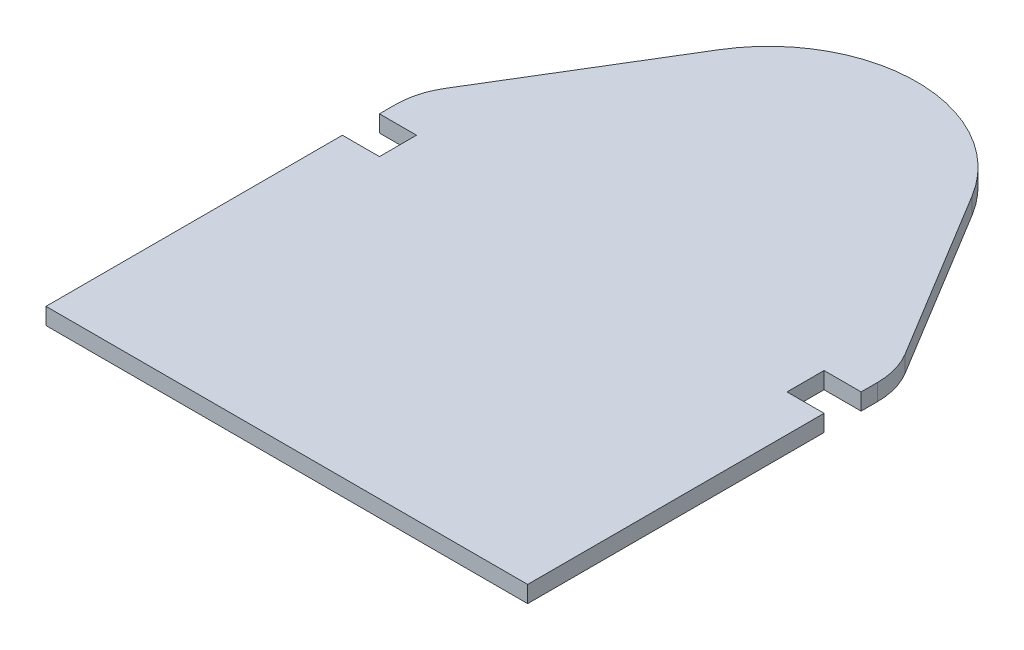
ISO-10303-21;
HEADER;
FILE_DESCRIPTION(('STEP AP214'),'2;1');
FILE_NAME('part.step','',(''),(''),'','','');
FILE_SCHEMA(('AUTOMOTIVE_DESIGN { 1 0 10303 214 1 1 1 1 }'));
ENDSEC;
DATA;
#1=APPLICATION_CONTEXT('core data for automotive mechanical design processes');
#2=APPLICATION_PROTOCOL_DEFINITION('international standard','automotive_design',2000,#1);
#3=PRODUCT_CONTEXT('',#1,'mechanical');
#4=PRODUCT('Part','Part','',(#3));
#5=PRODUCT_RELATED_PRODUCT_CATEGORY('part','',(#4));
#6=PRODUCT_DEFINITION_FORMATION('','',#4);
#7=PRODUCT_DEFINITION_CONTEXT('part definition',#1,'design');
#8=PRODUCT_DEFINITION('design','',#6,#7);
#9=PRODUCT_DEFINITION_SHAPE('','',#8);
#10=(LENGTH_UNIT() NAMED_UNIT(*) SI_UNIT(.MILLI.,.METRE.));
#11=(NAMED_UNIT(*) PLANE_ANGLE_UNIT() SI_UNIT($,.RADIAN.));
#12=(NAMED_UNIT(*) SI_UNIT($,.STERADIAN.) SOLID_ANGLE_UNIT());
#13=UNCERTAINTY_MEASURE_WITH_UNIT(LENGTH_MEASURE(1.E-05),#10,'distance_accuracy_value','');
#14=(GEOMETRIC_REPRESENTATION_CONTEXT(3) GLOBAL_UNCERTAINTY_ASSIGNED_CONTEXT((#13)) GLOBAL_UNIT_ASSIGNED_CONTEXT((#10,
#11,#12)) REPRESENTATION_CONTEXT('',''));
#15=CARTESIAN_POINT('',(0.,0.,0.));
#16=DIRECTION('',(0.,0.,1.));
#17=DIRECTION('',(1.,0.,0.));
#18=AXIS2_PLACEMENT_3D('',#15,#16,#17);
#19=CARTESIAN_POINT('',(65.,4.5,-25.));
#20=DIRECTION('',(-1.,0.,0.));
#21=DIRECTION('',(0.,0.,1.));
#22=AXIS2_PLACEMENT_3D('',#19,#20,#21);
#23=PLANE('',#22);
#24=DIRECTION('',(0.,0.,-1.));
#25=VECTOR('',#24,1.);
#26=CARTESIAN_POINT('',(65.,0.,-25.));
#27=LINE('',#26,#25);
#28=CARTESIAN_POINT('',(65.,0.,75.));
#29=VERTEX_POINT('',#28);
#30=CARTESIAN_POINT('',(65.,0.,-5.00000000000002));
#31=VERTEX_POINT('',#30);
#32=EDGE_CURVE('E328',#29,#31,#27,.T.);
#33=ORIENTED_EDGE('',*,*,#32,.T.);
#34=DIRECTION('',(0.,1.,0.));
#35=VECTOR('',#34,1.);
#36=CARTESIAN_POINT('',(65.,0.,-5.00000000000002));
#37=LINE('',#36,#35);
#38=CARTESIAN_POINT('',(65.,4.5,-5.00000000000002));
#39=VERTEX_POINT('',#38);
#40=EDGE_CURVE('E287',#31,#39,#37,.T.);
#41=ORIENTED_EDGE('',*,*,#40,.T.);
#42=DIRECTION('',(0.,0.,-1.));
#43=VECTOR('',#42,1.);
#44=CARTESIAN_POINT('',(65.,4.5,-25.));
#45=LINE('',#44,#43);
#46=CARTESIAN_POINT('',(65.,4.5,75.));
#47=VERTEX_POINT('',#46);
#48=EDGE_CURVE('E310',#47,#39,#45,.T.);
#49=ORIENTED_EDGE('',*,*,#48,.F.);
#50=DIRECTION('',(0.,-1.,0.));
#51=VECTOR('',#50,1.);
#52=CARTESIAN_POINT('',(65.,4.5,75.));
#53=LINE('',#52,#51);
#54=EDGE_CURVE('E201',#47,#29,#53,.T.);
#55=ORIENTED_EDGE('',*,*,#54,.T.);
#56=EDGE_LOOP('',(#33,#41,#49,#55));
#57=FACE_BOUND('',#56,.T.);
#58=ADVANCED_FACE('F48',(#57),#23,.F.);
#59=CARTESIAN_POINT('',(-65.,4.5,-25.));
#60=DIRECTION('',(1.,0.,0.));
#61=DIRECTION('',(0.,0.,-1.));
#62=AXIS2_PLACEMENT_3D('',#59,#60,#61);
#63=PLANE('',#62);
#64=DIRECTION('',(0.,0.,1.));
#65=VECTOR('',#64,1.);
#66=CARTESIAN_POINT('',(-65.,0.,-25.));
#67=LINE('',#66,#65);
#68=CARTESIAN_POINT('',(-65.,0.,-19.4053884885353));
#69=VERTEX_POINT('',#68);
#70=CARTESIAN_POINT('',(-65.,0.,-15.));
#71=VERTEX_POINT('',#70);
#72=EDGE_CURVE('E187',#69,#71,#67,.T.);
#73=ORIENTED_EDGE('',*,*,#72,.T.);
#74=DIRECTION('',(0.,1.,0.));
#75=VECTOR('',#74,1.);
#76=CARTESIAN_POINT('',(-65.,0.,-15.));
#77=LINE('',#76,#75);
#78=CARTESIAN_POINT('',(-65.,4.5,-15.));
#79=VERTEX_POINT('',#78);
#80=EDGE_CURVE('E268',#71,#79,#77,.T.);
#81=ORIENTED_EDGE('',*,*,#80,.T.);
#82=DIRECTION('',(0.,0.,1.));
#83=VECTOR('',#82,1.);
#84=CARTESIAN_POINT('',(-65.,4.5,-25.));
#85=LINE('',#84,#83);
#86=CARTESIAN_POINT('',(-65.,4.5,-19.4053884885353));
#87=VERTEX_POINT('',#86);
#88=EDGE_CURVE('E246',#87,#79,#85,.T.);
#89=ORIENTED_EDGE('',*,*,#88,.F.);
#90=DIRECTION('',(0.,-1.,0.));
#91=VECTOR('',#90,1.);
#92=CARTESIAN_POINT('',(-65.,4.5,-19.4053884885353));
#93=LINE('',#92,#91);
#94=EDGE_CURVE('E57',#87,#69,#93,.T.);
#95=ORIENTED_EDGE('',*,*,#94,.T.);
#96=EDGE_LOOP('',(#73,#81,#89,#95));
#97=FACE_BOUND('',#96,.T.);
#98=ADVANCED_FACE('F243',(#97),#63,.F.);
#99=CARTESIAN_POINT('',(65.,4.5,-15.));
#100=VERTEX_POINT('',#99);
#101=CARTESIAN_POINT('',(65.,4.5,-19.4053884885353));
#102=VERTEX_POINT('',#101);
#103=EDGE_CURVE('E200',#100,#102,#45,.T.);
#104=ORIENTED_EDGE('',*,*,#103,.F.);
#105=DIRECTION('',(0.,1.,0.));
#106=VECTOR('',#105,1.);
#107=CARTESIAN_POINT('',(65.,0.,-15.));
#108=LINE('',#107,#106);
#109=CARTESIAN_POINT('',(65.,0.,-15.));
#110=VERTEX_POINT('',#109);
#111=EDGE_CURVE('E277',#110,#100,#108,.T.);
#112=ORIENTED_EDGE('',*,*,#111,.F.);
#113=CARTESIAN_POINT('',(65.,0.,-19.4053884885353));
#114=VERTEX_POINT('',#113);
#115=EDGE_CURVE('E271',#110,#114,#27,.T.);
#116=ORIENTED_EDGE('',*,*,#115,.T.);
#117=DIRECTION('',(0.,-1.,0.));
#118=VECTOR('',#117,1.);
#119=CARTESIAN_POINT('',(65.,4.5,-19.4053884885353));
#120=LINE('',#119,#118);
#121=EDGE_CURVE('E228',#114,#102,#120,.F.);
#122=ORIENTED_EDGE('',*,*,#121,.T.);
#123=EDGE_LOOP('',(#104,#112,#116,#122));
#124=FACE_BOUND('',#123,.T.);
#125=ADVANCED_FACE('F363',(#124),#23,.F.);
#126=CARTESIAN_POINT('',(65.,4.5,-25.));
#127=DIRECTION('',(-0.854858792791353,0.,0.5188607177146));
#128=DIRECTION('',(0.5188607177146,0.,0.854858792791353));
#129=AXIS2_PLACEMENT_3D('',#126,#127,#128);
#130=PLANE('',#129);
#131=DIRECTION('',(-0.5188607177146,0.,-0.854858792791353));
#132=VECTOR('',#131,1.);
#133=CARTESIAN_POINT('',(65.,4.5,-25.));
#134=LINE('',#133,#132);
#135=CARTESIAN_POINT('',(62.0971758558271,4.5,-29.7826028428273));
#136=VERTEX_POINT('',#135);
#137=CARTESIAN_POINT('',(34.1943517116541,4.5,-75.754428708584));
#138=VERTEX_POINT('',#137);
#139=EDGE_CURVE('E314',#136,#138,#134,.T.);
#140=ORIENTED_EDGE('',*,*,#139,.F.);
#141=DIRECTION('',(0.,-1.,0.));
#142=VECTOR('',#141,1.);
#143=CARTESIAN_POINT('',(62.0971758558271,4.5,-29.7826028428273));
#144=LINE('',#143,#142);
#145=CARTESIAN_POINT('',(62.0971758558271,0.,-29.7826028428273));
#146=VERTEX_POINT('',#145);
#147=EDGE_CURVE('E217',#136,#146,#144,.T.);
#148=ORIENTED_EDGE('',*,*,#147,.T.);
#149=DIRECTION('',(-0.5188607177146,0.,-0.854858792791353));
#150=VECTOR('',#149,1.);
#151=CARTESIAN_POINT('',(65.,0.,-25.));
#152=LINE('',#151,#150);
#153=CARTESIAN_POINT('',(34.1943517116541,0.,-75.754428708584));
#154=VERTEX_POINT('',#153);
#155=EDGE_CURVE('E332',#146,#154,#152,.T.);
#156=ORIENTED_EDGE('',*,*,#155,.T.);
#157=DIRECTION('',(0.,-1.,0.));
#158=VECTOR('',#157,1.);
#159=CARTESIAN_POINT('',(34.1943517116541,4.5,-75.754428708584));
#160=LINE('',#159,#158);
#161=EDGE_CURVE('E213',#138,#154,#160,.T.);
#162=ORIENTED_EDGE('',*,*,#161,.F.);
#163=EDGE_LOOP('',(#140,#148,#156,#162));
#164=FACE_BOUND('',#163,.T.);
#165=ADVANCED_FACE('F370',(#164),#130,.F.);
#166=CARTESIAN_POINT('',(0.,4.5,-55.));
#167=DIRECTION('',(0.,-1.,0.));
#168=DIRECTION('',(0.,0.,-1.));
#169=AXIS2_PLACEMENT_3D('',#166,#167,#168);
#170=CYLINDRICAL_SURFACE('',#169,40.);
#171=CARTESIAN_POINT('',(0.,0.,-55.));
#172=DIRECTION('',(0.,1.,0.));
#173=DIRECTION('',(0.,0.,1.));
#174=AXIS2_PLACEMENT_3D('',#171,#172,#173);
#175=CIRCLE('',#174,40.);
#176=CARTESIAN_POINT('',(-34.1943517116542,0.,-75.754428708584));
#177=VERTEX_POINT('',#176);
#178=EDGE_CURVE('E194',#154,#177,#175,.T.);
#179=ORIENTED_EDGE('',*,*,#178,.T.);
#180=DIRECTION('',(0.,-1.,0.));
#181=VECTOR('',#180,1.);
#182=CARTESIAN_POINT('',(-34.1943517116542,4.5,-75.754428708584));
#183=LINE('',#182,#181);
#184=CARTESIAN_POINT('',(-34.1943517116542,4.5,-75.754428708584));
#185=VERTEX_POINT('',#184);
#186=EDGE_CURVE('E209',#185,#177,#183,.T.);
#187=ORIENTED_EDGE('',*,*,#186,.F.);
#188=CARTESIAN_POINT('',(0.,4.5,-55.));
#189=DIRECTION('',(0.,1.,0.));
#190=DIRECTION('',(0.,0.,1.));
#191=AXIS2_PLACEMENT_3D('',#188,#189,#190);
#192=CIRCLE('',#191,40.);
#193=EDGE_CURVE('E317',#138,#185,#192,.T.);
#194=ORIENTED_EDGE('',*,*,#193,.F.);
#195=ORIENTED_EDGE('',*,*,#161,.T.);
#196=EDGE_LOOP('',(#179,#187,#194,#195));
#197=FACE_BOUND('',#196,.T.);
#198=ADVANCED_FACE('F338',(#197),#170,.T.);
#199=CARTESIAN_POINT('',(-65.,4.5,-25.));
#200=DIRECTION('',(0.854858792791354,0.,0.5188607177146));
#201=DIRECTION('',(0.5188607177146,0.,-0.854858792791354));
#202=AXIS2_PLACEMENT_3D('',#199,#200,#201);
#203=PLANE('',#202);
#204=DIRECTION('',(-0.5188607177146,0.,0.854858792791354));
#205=VECTOR('',#204,1.);
#206=CARTESIAN_POINT('',(-65.,0.,-25.));
#207=LINE('',#206,#205);
#208=CARTESIAN_POINT('',(-62.0971758558271,0.,-29.7826028428273));
#209=VERTEX_POINT('',#208);
#210=EDGE_CURVE('E188',#177,#209,#207,.T.);
#211=ORIENTED_EDGE('',*,*,#210,.T.);
#212=DIRECTION('',(0.,-1.,0.));
#213=VECTOR('',#212,1.);
#214=CARTESIAN_POINT('',(-62.0971758558271,4.5,-29.7826028428273));
#215=LINE('',#214,#213);
#216=CARTESIAN_POINT('',(-62.0971758558271,4.5,-29.7826028428273));
#217=VERTEX_POINT('',#216);
#218=EDGE_CURVE('E11',#209,#217,#215,.F.);
#219=ORIENTED_EDGE('',*,*,#218,.T.);
#220=DIRECTION('',(-0.5188607177146,0.,0.854858792791354));
#221=VECTOR('',#220,1.);
#222=CARTESIAN_POINT('',(-65.,4.5,-25.));
#223=LINE('',#222,#221);
#224=EDGE_CURVE('E320',#185,#217,#223,.T.);
#225=ORIENTED_EDGE('',*,*,#224,.F.);
#226=ORIENTED_EDGE('',*,*,#186,.T.);
#227=EDGE_LOOP('',(#211,#219,#225,#226));
#228=FACE_BOUND('',#227,.T.);
#229=ADVANCED_FACE('F344',(#228),#203,.F.);
#230=CARTESIAN_POINT('',(-65.,4.5,-4.99999999999999));
#231=VERTEX_POINT('',#230);
#232=CARTESIAN_POINT('',(-65.,4.5,75.));
#233=VERTEX_POINT('',#232);
#234=EDGE_CURVE('E178',#231,#233,#85,.T.);
#235=ORIENTED_EDGE('',*,*,#234,.F.);
#236=DIRECTION('',(0.,1.,0.));
#237=VECTOR('',#236,1.);
#238=CARTESIAN_POINT('',(-65.,0.,-4.99999999999999));
#239=LINE('',#238,#237);
#240=CARTESIAN_POINT('',(-65.,0.,-4.99999999999999));
#241=VERTEX_POINT('',#240);
#242=EDGE_CURVE('E164',#241,#231,#239,.T.);
#243=ORIENTED_EDGE('',*,*,#242,.F.);
#244=CARTESIAN_POINT('',(-65.,0.,75.));
#245=VERTEX_POINT('',#244);
#246=EDGE_CURVE('E176',#241,#245,#67,.T.);
#247=ORIENTED_EDGE('',*,*,#246,.T.);
#248=DIRECTION('',(0.,-1.,0.));
#249=VECTOR('',#248,1.);
#250=CARTESIAN_POINT('',(-65.,4.5,75.));
#251=LINE('',#250,#249);
#252=EDGE_CURVE('E205',#233,#245,#251,.T.);
#253=ORIENTED_EDGE('',*,*,#252,.F.);
#254=EDGE_LOOP('',(#235,#243,#247,#253));
#255=FACE_BOUND('',#254,.T.);
#256=ADVANCED_FACE('F174',(#255),#63,.F.);
#257=CARTESIAN_POINT('',(-65.,4.5,75.));
#258=DIRECTION('',(0.,0.,-1.));
#259=DIRECTION('',(-1.,0.,0.));
#260=AXIS2_PLACEMENT_3D('',#257,#258,#259);
#261=PLANE('',#260);
#262=DIRECTION('',(1.,0.,0.));
#263=VECTOR('',#262,1.);
#264=CARTESIAN_POINT('',(-65.,0.,75.));
#265=LINE('',#264,#263);
#266=EDGE_CURVE('E185',#245,#29,#265,.T.);
#267=ORIENTED_EDGE('',*,*,#266,.T.);
#268=ORIENTED_EDGE('',*,*,#54,.F.);
#269=DIRECTION('',(1.,0.,0.));
#270=VECTOR('',#269,1.);
#271=CARTESIAN_POINT('',(-65.,4.5,75.));
#272=LINE('',#271,#270);
#273=EDGE_CURVE('E206',#233,#47,#272,.T.);
#274=ORIENTED_EDGE('',*,*,#273,.F.);
#275=ORIENTED_EDGE('',*,*,#252,.T.);
#276=EDGE_LOOP('',(#267,#268,#274,#275));
#277=FACE_BOUND('',#276,.T.);
#278=ADVANCED_FACE('F389',(#277),#261,.F.);
#279=CARTESIAN_POINT('',(0.,4.5,-55.));
#280=DIRECTION('',(0.,1.,0.));
#281=DIRECTION('',(0.,0.,1.));
#282=AXIS2_PLACEMENT_3D('',#279,#280,#281);
#283=PLANE('',#282);
#284=DIRECTION('',(-1.,0.,0.));
#285=VECTOR('',#284,1.);
#286=CARTESIAN_POINT('',(-65.,4.5,-15.));
#287=LINE('',#286,#285);
#288=CARTESIAN_POINT('',(-55.,4.5,-15.));
#289=VERTEX_POINT('',#288);
#290=EDGE_CURVE('E170',#289,#79,#287,.T.);
#291=ORIENTED_EDGE('',*,*,#290,.F.);
#292=DIRECTION('',(0.,0.,-1.));
#293=VECTOR('',#292,1.);
#294=CARTESIAN_POINT('',(-55.,4.5,-15.));
#295=LINE('',#294,#293);
#296=CARTESIAN_POINT('',(-55.,4.5,-4.99999999999999));
#297=VERTEX_POINT('',#296);
#298=EDGE_CURVE('E261',#297,#289,#295,.T.);
#299=ORIENTED_EDGE('',*,*,#298,.F.);
#300=DIRECTION('',(1.,0.,0.));
#301=VECTOR('',#300,1.);
#302=CARTESIAN_POINT('',(-65.,4.5,-4.99999999999999));
#303=LINE('',#302,#301);
#304=EDGE_CURVE('E258',#231,#297,#303,.T.);
#305=ORIENTED_EDGE('',*,*,#304,.F.);
#306=ORIENTED_EDGE('',*,*,#234,.T.);
#307=ORIENTED_EDGE('',*,*,#273,.T.);
#308=ORIENTED_EDGE('',*,*,#48,.T.);
#309=DIRECTION('',(1.,0.,0.));
#310=VECTOR('',#309,1.);
#311=CARTESIAN_POINT('',(65.,4.5,-5.00000000000002));
#312=LINE('',#311,#310);
#313=CARTESIAN_POINT('',(55.,4.5,-5.00000000000002));
#314=VERTEX_POINT('',#313);
#315=EDGE_CURVE('E291',#314,#39,#312,.T.);
#316=ORIENTED_EDGE('',*,*,#315,.F.);
#317=DIRECTION('',(0.,0.,1.));
#318=VECTOR('',#317,1.);
#319=CARTESIAN_POINT('',(55.,4.5,-15.));
#320=LINE('',#319,#318);
#321=CARTESIAN_POINT('',(55.,4.5,-15.));
#322=VERTEX_POINT('',#321);
#323=EDGE_CURVE('E294',#322,#314,#320,.T.);
#324=ORIENTED_EDGE('',*,*,#323,.F.);
#325=DIRECTION('',(-1.,0.,0.));
#326=VECTOR('',#325,1.);
#327=CARTESIAN_POINT('',(65.,4.5,-15.));
#328=LINE('',#327,#326);
#329=EDGE_CURVE('E262',#100,#322,#328,.T.);
#330=ORIENTED_EDGE('',*,*,#329,.F.);
#331=ORIENTED_EDGE('',*,*,#103,.T.);
#332=CARTESIAN_POINT('',(45.,4.5,-19.4053884885353));
#333=DIRECTION('',(0.,1.,0.));
#334=DIRECTION('',(0.,0.,1.));
#335=AXIS2_PLACEMENT_3D('',#332,#333,#334);
#336=CIRCLE('',#335,20.);
#337=EDGE_CURVE('E235',#102,#136,#336,.T.);
#338=ORIENTED_EDGE('',*,*,#337,.T.);
#339=ORIENTED_EDGE('',*,*,#139,.T.);
#340=ORIENTED_EDGE('',*,*,#193,.T.);
#341=ORIENTED_EDGE('',*,*,#224,.T.);
#342=CARTESIAN_POINT('',(-45.,4.5,-19.4053884885353));
#343=DIRECTION('',(0.,1.,0.));
#344=DIRECTION('',(0.,0.,1.));
#345=AXIS2_PLACEMENT_3D('',#342,#343,#344);
#346=CIRCLE('',#345,20.);
#347=EDGE_CURVE('E232',#217,#87,#346,.T.);
#348=ORIENTED_EDGE('',*,*,#347,.T.);
#349=ORIENTED_EDGE('',*,*,#88,.T.);
#350=EDGE_LOOP('',(#291,#299,#305,#306,#307,#308,#316,#324,#330,#331,#338,#339,#340,#341,#348,#349));
#351=FACE_BOUND('',#350,.T.);
#352=ADVANCED_FACE('F348',(#351),#283,.T.);
#353=CARTESIAN_POINT('',(0.,0.,-55.));
#354=DIRECTION('',(0.,1.,0.));
#355=DIRECTION('',(0.,0.,1.));
#356=AXIS2_PLACEMENT_3D('',#353,#354,#355);
#357=PLANE('',#356);
#358=DIRECTION('',(0.,0.,-1.));
#359=VECTOR('',#358,1.);
#360=CARTESIAN_POINT('',(-55.,0.,-15.));
#361=LINE('',#360,#359);
#362=CARTESIAN_POINT('',(-55.,0.,-4.99999999999999));
#363=VERTEX_POINT('',#362);
#364=CARTESIAN_POINT('',(-55.,0.,-15.));
#365=VERTEX_POINT('',#364);
#366=EDGE_CURVE('E64',#363,#365,#361,.T.);
#367=ORIENTED_EDGE('',*,*,#366,.T.);
#368=DIRECTION('',(-1.,0.,0.));
#369=VECTOR('',#368,1.);
#370=CARTESIAN_POINT('',(-65.,0.,-15.));
#371=LINE('',#370,#369);
#372=EDGE_CURVE('E180',#365,#71,#371,.T.);
#373=ORIENTED_EDGE('',*,*,#372,.T.);
#374=ORIENTED_EDGE('',*,*,#72,.F.);
#375=CARTESIAN_POINT('',(-45.,0.,-19.4053884885353));
#376=DIRECTION('',(0.,1.,0.));
#377=DIRECTION('',(0.,0.,1.));
#378=AXIS2_PLACEMENT_3D('',#375,#376,#377);
#379=CIRCLE('',#378,20.);
#380=EDGE_CURVE('E221',#69,#209,#379,.F.);
#381=ORIENTED_EDGE('',*,*,#380,.T.);
#382=ORIENTED_EDGE('',*,*,#210,.F.);
#383=ORIENTED_EDGE('',*,*,#178,.F.);
#384=ORIENTED_EDGE('',*,*,#155,.F.);
#385=CARTESIAN_POINT('',(45.,0.,-19.4053884885353));
#386=DIRECTION('',(0.,1.,0.));
#387=DIRECTION('',(0.,0.,1.));
#388=AXIS2_PLACEMENT_3D('',#385,#386,#387);
#389=CIRCLE('',#388,20.);
#390=EDGE_CURVE('E224',#146,#114,#389,.F.);
#391=ORIENTED_EDGE('',*,*,#390,.T.);
#392=ORIENTED_EDGE('',*,*,#115,.F.);
#393=DIRECTION('',(-1.,0.,0.));
#394=VECTOR('',#393,1.);
#395=CARTESIAN_POINT('',(65.,0.,-15.));
#396=LINE('',#395,#394);
#397=CARTESIAN_POINT('',(55.,0.,-15.));
#398=VERTEX_POINT('',#397);
#399=EDGE_CURVE('E295',#110,#398,#396,.T.);
#400=ORIENTED_EDGE('',*,*,#399,.T.);
#401=DIRECTION('',(0.,0.,1.));
#402=VECTOR('',#401,1.);
#403=CARTESIAN_POINT('',(55.,0.,-15.));
#404=LINE('',#403,#402);
#405=CARTESIAN_POINT('',(55.,0.,-5.00000000000002));
#406=VERTEX_POINT('',#405);
#407=EDGE_CURVE('E72',#398,#406,#404,.T.);
#408=ORIENTED_EDGE('',*,*,#407,.T.);
#409=DIRECTION('',(1.,0.,0.));
#410=VECTOR('',#409,1.);
#411=CARTESIAN_POINT('',(65.,0.,-5.00000000000002));
#412=LINE('',#411,#410);
#413=EDGE_CURVE('E280',#406,#31,#412,.T.);
#414=ORIENTED_EDGE('',*,*,#413,.T.);
#415=ORIENTED_EDGE('',*,*,#32,.F.);
#416=ORIENTED_EDGE('',*,*,#266,.F.);
#417=ORIENTED_EDGE('',*,*,#246,.F.);
#418=DIRECTION('',(1.,0.,0.));
#419=VECTOR('',#418,1.);
#420=CARTESIAN_POINT('',(-65.,0.,-4.99999999999999));
#421=LINE('',#420,#419);
#422=EDGE_CURVE('E160',#241,#363,#421,.T.);
#423=ORIENTED_EDGE('',*,*,#422,.T.);
#424=EDGE_LOOP('',(#367,#373,#374,#381,#382,#383,#384,#391,#392,#400,#408,#414,#415,#416,#417,#423));
#425=FACE_BOUND('',#424,.T.);
#426=ADVANCED_FACE('F183',(#425),#357,.F.);
#427=CARTESIAN_POINT('',(45.,4.5,-19.4053884885353));
#428=DIRECTION('',(0.,-1.,0.));
#429=DIRECTION('',(0.,0.,-1.));
#430=AXIS2_PLACEMENT_3D('',#427,#428,#429);
#431=CYLINDRICAL_SURFACE('',#430,20.);
#432=ORIENTED_EDGE('',*,*,#337,.F.);
#433=ORIENTED_EDGE('',*,*,#121,.F.);
#434=ORIENTED_EDGE('',*,*,#390,.F.);
#435=ORIENTED_EDGE('',*,*,#147,.F.);
#436=EDGE_LOOP('',(#432,#433,#434,#435));
#437=FACE_BOUND('',#436,.T.);
#438=ADVANCED_FACE('F351',(#437),#431,.T.);
#439=CARTESIAN_POINT('',(-45.,4.5,-19.4053884885353));
#440=DIRECTION('',(0.,-1.,0.));
#441=DIRECTION('',(0.,0.,-1.));
#442=AXIS2_PLACEMENT_3D('',#439,#440,#441);
#443=CYLINDRICAL_SURFACE('',#442,20.);
#444=ORIENTED_EDGE('',*,*,#347,.F.);
#445=ORIENTED_EDGE('',*,*,#218,.F.);
#446=ORIENTED_EDGE('',*,*,#380,.F.);
#447=ORIENTED_EDGE('',*,*,#94,.F.);
#448=EDGE_LOOP('',(#444,#445,#446,#447));
#449=FACE_BOUND('',#448,.T.);
#450=ADVANCED_FACE('F50',(#449),#443,.T.);
#451=CARTESIAN_POINT('',(65.,0.,-5.00000000000002));
#452=DIRECTION('',(0.,0.,1.));
#453=DIRECTION('',(1.,0.,0.));
#454=AXIS2_PLACEMENT_3D('',#451,#452,#453);
#455=PLANE('',#454);
#456=ORIENTED_EDGE('',*,*,#315,.T.);
#457=ORIENTED_EDGE('',*,*,#40,.F.);
#458=ORIENTED_EDGE('',*,*,#413,.F.);
#459=DIRECTION('',(0.,1.,0.));
#460=VECTOR('',#459,1.);
#461=CARTESIAN_POINT('',(55.,0.,-5.00000000000002));
#462=LINE('',#461,#460);
#463=EDGE_CURVE('E284',#406,#314,#462,.T.);
#464=ORIENTED_EDGE('',*,*,#463,.T.);
#465=EDGE_LOOP('',(#456,#457,#458,#464));
#466=FACE_BOUND('',#465,.T.);
#467=ADVANCED_FACE('F350',(#466),#455,.F.);
#468=CARTESIAN_POINT('',(55.,0.,-15.));
#469=DIRECTION('',(-1.,0.,0.));
#470=DIRECTION('',(0.,0.,1.));
#471=AXIS2_PLACEMENT_3D('',#468,#469,#470);
#472=PLANE('',#471);
#473=ORIENTED_EDGE('',*,*,#323,.T.);
#474=ORIENTED_EDGE('',*,*,#463,.F.);
#475=ORIENTED_EDGE('',*,*,#407,.F.);
#476=DIRECTION('',(0.,1.,0.));
#477=VECTOR('',#476,1.);
#478=CARTESIAN_POINT('',(55.,0.,-15.));
#479=LINE('',#478,#477);
#480=EDGE_CURVE('E281',#398,#322,#479,.T.);
#481=ORIENTED_EDGE('',*,*,#480,.T.);
#482=EDGE_LOOP('',(#473,#474,#475,#481));
#483=FACE_BOUND('',#482,.T.);
#484=ADVANCED_FACE('F357',(#483),#472,.F.);
#485=CARTESIAN_POINT('',(65.,0.,-15.));
#486=DIRECTION('',(0.,0.,-1.));
#487=DIRECTION('',(-1.,0.,0.));
#488=AXIS2_PLACEMENT_3D('',#485,#486,#487);
#489=PLANE('',#488);
#490=ORIENTED_EDGE('',*,*,#329,.T.);
#491=ORIENTED_EDGE('',*,*,#480,.F.);
#492=ORIENTED_EDGE('',*,*,#399,.F.);
#493=ORIENTED_EDGE('',*,*,#111,.T.);
#494=EDGE_LOOP('',(#490,#491,#492,#493));
#495=FACE_BOUND('',#494,.T.);
#496=ADVANCED_FACE('F395',(#495),#489,.F.);
#497=CARTESIAN_POINT('',(-65.,0.,-15.));
#498=DIRECTION('',(0.,0.,-1.));
#499=DIRECTION('',(-1.,0.,0.));
#500=AXIS2_PLACEMENT_3D('',#497,#498,#499);
#501=PLANE('',#500);
#502=ORIENTED_EDGE('',*,*,#290,.T.);
#503=ORIENTED_EDGE('',*,*,#80,.F.);
#504=ORIENTED_EDGE('',*,*,#372,.F.);
#505=DIRECTION('',(0.,1.,0.));
#506=VECTOR('',#505,1.);
#507=CARTESIAN_POINT('',(-55.,0.,-15.));
#508=LINE('',#507,#506);
#509=EDGE_CURVE('E272',#365,#289,#508,.T.);
#510=ORIENTED_EDGE('',*,*,#509,.T.);
#511=EDGE_LOOP('',(#502,#503,#504,#510));
#512=FACE_BOUND('',#511,.T.);
#513=ADVANCED_FACE('F400',(#512),#501,.F.);
#514=CARTESIAN_POINT('',(-55.,0.,-15.));
#515=DIRECTION('',(1.,0.,0.));
#516=DIRECTION('',(0.,0.,-1.));
#517=AXIS2_PLACEMENT_3D('',#514,#515,#516);
#518=PLANE('',#517);
#519=ORIENTED_EDGE('',*,*,#298,.T.);
#520=ORIENTED_EDGE('',*,*,#509,.F.);
#521=ORIENTED_EDGE('',*,*,#366,.F.);
#522=DIRECTION('',(0.,1.,0.));
#523=VECTOR('',#522,1.);
#524=CARTESIAN_POINT('',(-55.,0.,-4.99999999999999));
#525=LINE('',#524,#523);
#526=EDGE_CURVE('E166',#363,#297,#525,.T.);
#527=ORIENTED_EDGE('',*,*,#526,.T.);
#528=EDGE_LOOP('',(#519,#520,#521,#527));
#529=FACE_BOUND('',#528,.T.);
#530=ADVANCED_FACE('F406',(#529),#518,.F.);
#531=CARTESIAN_POINT('',(-65.,0.,-4.99999999999999));
#532=DIRECTION('',(0.,0.,1.));
#533=DIRECTION('',(1.,0.,0.));
#534=AXIS2_PLACEMENT_3D('',#531,#532,#533);
#535=PLANE('',#534);
#536=ORIENTED_EDGE('',*,*,#304,.T.);
#537=ORIENTED_EDGE('',*,*,#526,.F.);
#538=ORIENTED_EDGE('',*,*,#422,.F.);
#539=ORIENTED_EDGE('',*,*,#242,.T.);
#540=EDGE_LOOP('',(#536,#537,#538,#539));
#541=FACE_BOUND('',#540,.T.);
#542=ADVANCED_FACE('F163',(#541),#535,.F.);
#543=CLOSED_SHELL('',(#58,#98,#125,#165,#198,#229,#256,#278,#352,#426,#438,#450,#467,#484,#496,
#513,#530,#542));
#544=MANIFOLD_SOLID_BREP('B2',#543);
#545=ADVANCED_BREP_SHAPE_REPRESENTATION('',(#18,#544),#14);
#546=SHAPE_DEFINITION_REPRESENTATION(#9,#545);
ENDSEC;
END-ISO-10303-21;
